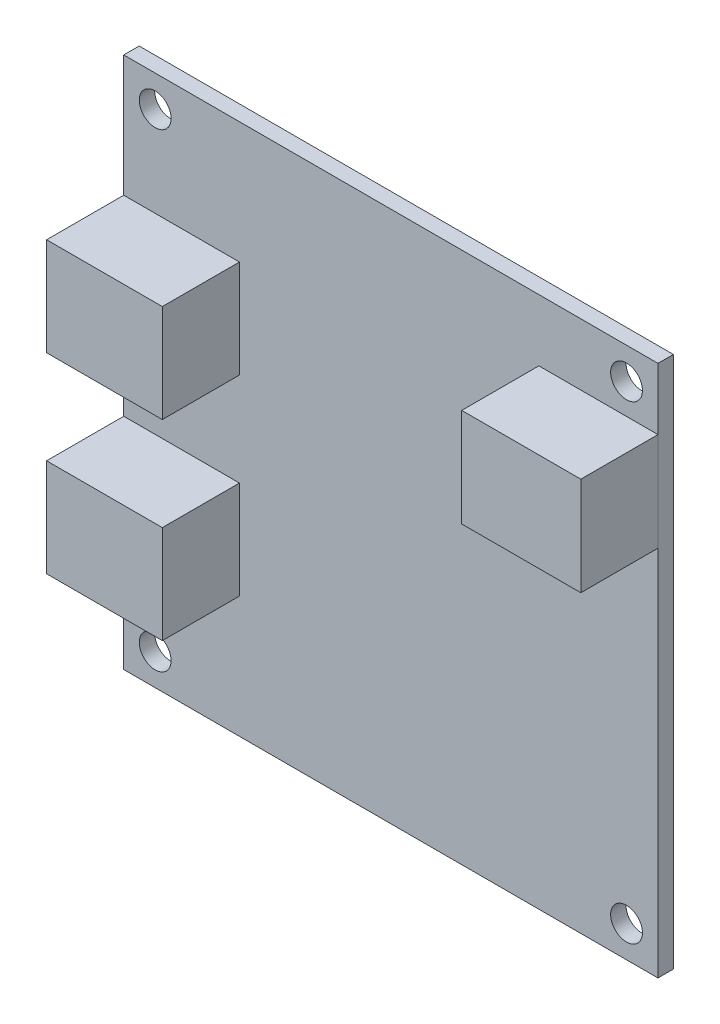
ISO-10303-21;
HEADER;
FILE_DESCRIPTION(('STEP AP214'),'2;1');
FILE_NAME('part.step','',(''),(''),'','','');
FILE_SCHEMA(('AUTOMOTIVE_DESIGN { 1 0 10303 214 1 1 1 1 }'));
ENDSEC;
DATA;
#1=APPLICATION_CONTEXT('core data for automotive mechanical design processes');
#2=APPLICATION_PROTOCOL_DEFINITION('international standard','automotive_design',2000,#1);
#3=PRODUCT_CONTEXT('',#1,'mechanical');
#4=PRODUCT('Part','Part','',(#3));
#5=PRODUCT_RELATED_PRODUCT_CATEGORY('part','',(#4));
#6=PRODUCT_DEFINITION_FORMATION('','',#4);
#7=PRODUCT_DEFINITION_CONTEXT('part definition',#1,'design');
#8=PRODUCT_DEFINITION('design','',#6,#7);
#9=PRODUCT_DEFINITION_SHAPE('','',#8);
#10=(LENGTH_UNIT() NAMED_UNIT(*) SI_UNIT(.MILLI.,.METRE.));
#11=(NAMED_UNIT(*) PLANE_ANGLE_UNIT() SI_UNIT($,.RADIAN.));
#12=(NAMED_UNIT(*) SI_UNIT($,.STERADIAN.) SOLID_ANGLE_UNIT());
#13=UNCERTAINTY_MEASURE_WITH_UNIT(LENGTH_MEASURE(1.E-05),#10,'distance_accuracy_value','');
#14=(GEOMETRIC_REPRESENTATION_CONTEXT(3) GLOBAL_UNCERTAINTY_ASSIGNED_CONTEXT((#13)) GLOBAL_UNIT_ASSIGNED_CONTEXT((#10,
#11,#12)) REPRESENTATION_CONTEXT('',''));
#15=CARTESIAN_POINT('',(0.,0.,0.));
#16=DIRECTION('',(0.,0.,1.));
#17=DIRECTION('',(1.,0.,0.));
#18=AXIS2_PLACEMENT_3D('',#15,#16,#17);
#19=CARTESIAN_POINT('',(15.35,0.,8.));
#20=DIRECTION('',(1.,0.,0.));
#21=DIRECTION('',(0.,0.,-1.));
#22=AXIS2_PLACEMENT_3D('',#19,#20,#21);
#23=PLANE('',#22);
#24=DIRECTION('',(0.,-1.,0.));
#25=VECTOR('',#24,1.);
#26=CARTESIAN_POINT('',(15.35,0.,0.));
#27=LINE('',#26,#25);
#28=CARTESIAN_POINT('',(15.35,21.2,0.));
#29=VERTEX_POINT('',#28);
#30=CARTESIAN_POINT('',(15.35,11.,0.));
#31=VERTEX_POINT('',#30);
#32=EDGE_CURVE('E117',#29,#31,#27,.T.);
#33=ORIENTED_EDGE('',*,*,#32,.T.);
#34=DIRECTION('',(0.,0.,-1.));
#35=VECTOR('',#34,1.);
#36=CARTESIAN_POINT('',(15.35,11.,8.));
#37=LINE('',#36,#35);
#38=CARTESIAN_POINT('',(15.35,11.,8.));
#39=VERTEX_POINT('',#38);
#40=EDGE_CURVE('E12',#39,#31,#37,.T.);
#41=ORIENTED_EDGE('',*,*,#40,.F.);
#42=DIRECTION('',(0.,-1.,0.));
#43=VECTOR('',#42,1.);
#44=CARTESIAN_POINT('',(15.35,0.,8.));
#45=LINE('',#44,#43);
#46=CARTESIAN_POINT('',(15.35,21.2,8.));
#47=VERTEX_POINT('',#46);
#48=EDGE_CURVE('E105',#47,#39,#45,.T.);
#49=ORIENTED_EDGE('',*,*,#48,.F.);
#50=DIRECTION('',(0.,0.,-1.));
#51=VECTOR('',#50,1.);
#52=CARTESIAN_POINT('',(15.35,21.2,8.));
#53=LINE('',#52,#51);
#54=EDGE_CURVE('E113',#47,#29,#53,.T.);
#55=ORIENTED_EDGE('',*,*,#54,.T.);
#56=EDGE_LOOP('',(#33,#41,#49,#55));
#57=FACE_BOUND('',#56,.T.);
#58=ADVANCED_FACE('F54',(#57),#23,.F.);
#59=CARTESIAN_POINT('',(0.,11.,8.));
#60=DIRECTION('',(0.,1.,0.));
#61=DIRECTION('',(0.,0.,1.));
#62=AXIS2_PLACEMENT_3D('',#59,#60,#61);
#63=PLANE('',#62);
#64=DIRECTION('',(1.,0.,0.));
#65=VECTOR('',#64,1.);
#66=CARTESIAN_POINT('',(0.,11.,0.));
#67=LINE('',#66,#65);
#68=CARTESIAN_POINT('',(27.7,11.,0.));
#69=VERTEX_POINT('',#68);
#70=EDGE_CURVE('E109',#31,#69,#67,.T.);
#71=ORIENTED_EDGE('',*,*,#70,.T.);
#72=DIRECTION('',(0.,0.,-1.));
#73=VECTOR('',#72,1.);
#74=CARTESIAN_POINT('',(27.7,11.,8.));
#75=LINE('',#74,#73);
#76=CARTESIAN_POINT('',(27.7,11.,8.));
#77=VERTEX_POINT('',#76);
#78=EDGE_CURVE('E62',#77,#69,#75,.T.);
#79=ORIENTED_EDGE('',*,*,#78,.F.);
#80=DIRECTION('',(1.,0.,0.));
#81=VECTOR('',#80,1.);
#82=CARTESIAN_POINT('',(0.,11.,8.));
#83=LINE('',#82,#81);
#84=EDGE_CURVE('E100',#39,#77,#83,.T.);
#85=ORIENTED_EDGE('',*,*,#84,.F.);
#86=ORIENTED_EDGE('',*,*,#40,.T.);
#87=EDGE_LOOP('',(#71,#79,#85,#86));
#88=FACE_BOUND('',#87,.T.);
#89=ADVANCED_FACE('F108',(#88),#63,.F.);
#90=CARTESIAN_POINT('',(27.7,0.,8.));
#91=DIRECTION('',(-1.,0.,0.));
#92=DIRECTION('',(0.,0.,1.));
#93=AXIS2_PLACEMENT_3D('',#90,#91,#92);
#94=PLANE('',#93);
#95=DIRECTION('',(0.,1.,0.));
#96=VECTOR('',#95,1.);
#97=CARTESIAN_POINT('',(27.7,0.,0.));
#98=LINE('',#97,#96);
#99=CARTESIAN_POINT('',(27.7,21.2,0.));
#100=VERTEX_POINT('',#99);
#101=EDGE_CURVE('E87',#69,#100,#98,.T.);
#102=ORIENTED_EDGE('',*,*,#101,.T.);
#103=DIRECTION('',(0.,0.,-1.));
#104=VECTOR('',#103,1.);
#105=CARTESIAN_POINT('',(27.7,21.2,8.));
#106=LINE('',#105,#104);
#107=CARTESIAN_POINT('',(27.7,21.2,8.));
#108=VERTEX_POINT('',#107);
#109=EDGE_CURVE('E110',#108,#100,#106,.T.);
#110=ORIENTED_EDGE('',*,*,#109,.F.);
#111=DIRECTION('',(0.,1.,0.));
#112=VECTOR('',#111,1.);
#113=CARTESIAN_POINT('',(27.7,0.,8.));
#114=LINE('',#113,#112);
#115=EDGE_CURVE('E103',#77,#108,#114,.T.);
#116=ORIENTED_EDGE('',*,*,#115,.F.);
#117=ORIENTED_EDGE('',*,*,#78,.T.);
#118=EDGE_LOOP('',(#102,#110,#116,#117));
#119=FACE_BOUND('',#118,.T.);
#120=ADVANCED_FACE('F111',(#119),#94,.F.);
#121=CARTESIAN_POINT('',(0.,21.2,8.));
#122=DIRECTION('',(0.,-1.,0.));
#123=DIRECTION('',(0.,0.,-1.));
#124=AXIS2_PLACEMENT_3D('',#121,#122,#123);
#125=PLANE('',#124);
#126=DIRECTION('',(-1.,0.,0.));
#127=VECTOR('',#126,1.);
#128=CARTESIAN_POINT('',(0.,21.2,0.));
#129=LINE('',#128,#127);
#130=EDGE_CURVE('E93',#100,#29,#129,.T.);
#131=ORIENTED_EDGE('',*,*,#130,.T.);
#132=ORIENTED_EDGE('',*,*,#54,.F.);
#133=DIRECTION('',(-1.,0.,0.));
#134=VECTOR('',#133,1.);
#135=CARTESIAN_POINT('',(0.,21.2,8.));
#136=LINE('',#135,#134);
#137=EDGE_CURVE('E70',#108,#47,#136,.T.);
#138=ORIENTED_EDGE('',*,*,#137,.F.);
#139=ORIENTED_EDGE('',*,*,#109,.T.);
#140=EDGE_LOOP('',(#131,#132,#138,#139));
#141=FACE_BOUND('',#140,.T.);
#142=ADVANCED_FACE('F124',(#141),#125,.F.);
#143=CARTESIAN_POINT('',(0.,0.,8.));
#144=DIRECTION('',(0.,0.,1.));
#145=DIRECTION('',(1.,0.,0.));
#146=AXIS2_PLACEMENT_3D('',#143,#144,#145);
#147=PLANE('',#146);
#148=ORIENTED_EDGE('',*,*,#48,.T.);
#149=ORIENTED_EDGE('',*,*,#84,.T.);
#150=ORIENTED_EDGE('',*,*,#115,.T.);
#151=ORIENTED_EDGE('',*,*,#137,.T.);
#152=EDGE_LOOP('',(#148,#149,#150,#151));
#153=FACE_BOUND('',#152,.T.);
#154=ADVANCED_FACE('F101',(#153),#147,.T.);
#155=CARTESIAN_POINT('',(0.,0.,0.));
#156=DIRECTION('',(0.,0.,1.));
#157=DIRECTION('',(1.,0.,0.));
#158=AXIS2_PLACEMENT_3D('',#155,#156,#157);
#159=PLANE('',#158);
#160=ORIENTED_EDGE('',*,*,#32,.F.);
#161=ORIENTED_EDGE('',*,*,#130,.F.);
#162=ORIENTED_EDGE('',*,*,#101,.F.);
#163=ORIENTED_EDGE('',*,*,#70,.F.);
#164=EDGE_LOOP('',(#160,#161,#162,#163));
#165=FACE_BOUND('',#164,.T.);
#166=ADVANCED_FACE('F127',(#165),#159,.F.);
#167=CLOSED_SHELL('',(#58,#89,#120,#142,#154,#166));
#168=MANIFOLD_SOLID_BREP('B2',#167);
#169=CARTESIAN_POINT('',(0.,-15.,8.));
#170=DIRECTION('',(0.,-1.,0.));
#171=DIRECTION('',(1.,0.,0.));
#172=AXIS2_PLACEMENT_3D('',#169,#170,#171);
#173=PLANE('',#172);
#174=DIRECTION('',(-1.,0.,0.));
#175=VECTOR('',#174,1.);
#176=CARTESIAN_POINT('',(0.,-15.,0.));
#177=LINE('',#176,#175);
#178=CARTESIAN_POINT('',(-15.7,-15.,0.));
#179=VERTEX_POINT('',#178);
#180=CARTESIAN_POINT('',(-27.7,-15.,0.));
#181=VERTEX_POINT('',#180);
#182=EDGE_CURVE('E257',#179,#181,#177,.T.);
#183=ORIENTED_EDGE('',*,*,#182,.F.);
#184=DIRECTION('',(0.,0.,-1.));
#185=VECTOR('',#184,1.);
#186=CARTESIAN_POINT('',(-15.7,-15.,8.));
#187=LINE('',#186,#185);
#188=CARTESIAN_POINT('',(-15.7,-15.,8.));
#189=VERTEX_POINT('',#188);
#190=EDGE_CURVE('E52',#189,#179,#187,.T.);
#191=ORIENTED_EDGE('',*,*,#190,.F.);
#192=DIRECTION('',(-1.,0.,0.));
#193=VECTOR('',#192,1.);
#194=CARTESIAN_POINT('',(0.,-15.,8.));
#195=LINE('',#194,#193);
#196=CARTESIAN_POINT('',(-27.7,-15.,8.));
#197=VERTEX_POINT('',#196);
#198=EDGE_CURVE('E249',#189,#197,#195,.T.);
#199=ORIENTED_EDGE('',*,*,#198,.T.);
#200=DIRECTION('',(0.,0.,-1.));
#201=VECTOR('',#200,1.);
#202=CARTESIAN_POINT('',(-27.7,-15.,8.));
#203=LINE('',#202,#201);
#204=EDGE_CURVE('E210',#197,#181,#203,.T.);
#205=ORIENTED_EDGE('',*,*,#204,.T.);
#206=EDGE_LOOP('',(#183,#191,#199,#205));
#207=FACE_BOUND('',#206,.T.);
#208=ADVANCED_FACE('F194',(#207),#173,.T.);
#209=CARTESIAN_POINT('',(-15.7,0.,8.));
#210=DIRECTION('',(1.,0.,0.));
#211=DIRECTION('',(0.,0.,-1.));
#212=AXIS2_PLACEMENT_3D('',#209,#210,#211);
#213=PLANE('',#212);
#214=DIRECTION('',(0.,-1.,0.));
#215=VECTOR('',#214,1.);
#216=CARTESIAN_POINT('',(-15.7,0.,0.));
#217=LINE('',#216,#215);
#218=CARTESIAN_POINT('',(-15.7,-4.85000000000001,0.));
#219=VERTEX_POINT('',#218);
#220=EDGE_CURVE('E240',#219,#179,#217,.T.);
#221=ORIENTED_EDGE('',*,*,#220,.F.);
#222=DIRECTION('',(0.,0.,-1.));
#223=VECTOR('',#222,1.);
#224=CARTESIAN_POINT('',(-15.7,-4.85000000000001,8.));
#225=LINE('',#224,#223);
#226=CARTESIAN_POINT('',(-15.7,-4.85000000000001,8.));
#227=VERTEX_POINT('',#226);
#228=EDGE_CURVE('E202',#227,#219,#225,.T.);
#229=ORIENTED_EDGE('',*,*,#228,.F.);
#230=DIRECTION('',(0.,-1.,0.));
#231=VECTOR('',#230,1.);
#232=CARTESIAN_POINT('',(-15.7,0.,8.));
#233=LINE('',#232,#231);
#234=EDGE_CURVE('E238',#227,#189,#233,.T.);
#235=ORIENTED_EDGE('',*,*,#234,.T.);
#236=ORIENTED_EDGE('',*,*,#190,.T.);
#237=EDGE_LOOP('',(#221,#229,#235,#236));
#238=FACE_BOUND('',#237,.T.);
#239=ADVANCED_FACE('F237',(#238),#213,.T.);
#240=CARTESIAN_POINT('',(0.,-4.85000000000001,8.));
#241=DIRECTION('',(0.,1.,0.));
#242=DIRECTION('',(0.,0.,1.));
#243=AXIS2_PLACEMENT_3D('',#240,#241,#242);
#244=PLANE('',#243);
#245=DIRECTION('',(1.,0.,0.));
#246=VECTOR('',#245,1.);
#247=CARTESIAN_POINT('',(0.,-4.85000000000001,0.));
#248=LINE('',#247,#246);
#249=CARTESIAN_POINT('',(-27.7,-4.85000000000001,0.));
#250=VERTEX_POINT('',#249);
#251=EDGE_CURVE('E260',#250,#219,#248,.T.);
#252=ORIENTED_EDGE('',*,*,#251,.F.);
#253=DIRECTION('',(0.,0.,-1.));
#254=VECTOR('',#253,1.);
#255=CARTESIAN_POINT('',(-27.7,-4.85000000000001,8.));
#256=LINE('',#255,#254);
#257=CARTESIAN_POINT('',(-27.7,-4.85000000000001,8.));
#258=VERTEX_POINT('',#257);
#259=EDGE_CURVE('E223',#258,#250,#256,.T.);
#260=ORIENTED_EDGE('',*,*,#259,.F.);
#261=DIRECTION('',(1.,0.,0.));
#262=VECTOR('',#261,1.);
#263=CARTESIAN_POINT('',(0.,-4.85000000000001,8.));
#264=LINE('',#263,#262);
#265=EDGE_CURVE('E248',#258,#227,#264,.T.);
#266=ORIENTED_EDGE('',*,*,#265,.T.);
#267=ORIENTED_EDGE('',*,*,#228,.T.);
#268=EDGE_LOOP('',(#252,#260,#266,#267));
#269=FACE_BOUND('',#268,.T.);
#270=ADVANCED_FACE('F251',(#269),#244,.T.);
#271=CARTESIAN_POINT('',(-27.7,0.,8.));
#272=DIRECTION('',(-1.,0.,0.));
#273=DIRECTION('',(0.,0.,1.));
#274=AXIS2_PLACEMENT_3D('',#271,#272,#273);
#275=PLANE('',#274);
#276=DIRECTION('',(0.,1.,0.));
#277=VECTOR('',#276,1.);
#278=CARTESIAN_POINT('',(-27.7,0.,0.));
#279=LINE('',#278,#277);
#280=EDGE_CURVE('E262',#181,#250,#279,.T.);
#281=ORIENTED_EDGE('',*,*,#280,.F.);
#282=ORIENTED_EDGE('',*,*,#204,.F.);
#283=DIRECTION('',(0.,1.,0.));
#284=VECTOR('',#283,1.);
#285=CARTESIAN_POINT('',(-27.7,0.,8.));
#286=LINE('',#285,#284);
#287=EDGE_CURVE('E252',#197,#258,#286,.T.);
#288=ORIENTED_EDGE('',*,*,#287,.T.);
#289=ORIENTED_EDGE('',*,*,#259,.T.);
#290=EDGE_LOOP('',(#281,#282,#288,#289));
#291=FACE_BOUND('',#290,.T.);
#292=ADVANCED_FACE('F267',(#291),#275,.T.);
#293=CARTESIAN_POINT('',(0.,0.,8.));
#294=DIRECTION('',(0.,0.,1.));
#295=DIRECTION('',(1.,0.,0.));
#296=AXIS2_PLACEMENT_3D('',#293,#294,#295);
#297=PLANE('',#296);
#298=ORIENTED_EDGE('',*,*,#198,.F.);
#299=ORIENTED_EDGE('',*,*,#234,.F.);
#300=ORIENTED_EDGE('',*,*,#265,.F.);
#301=ORIENTED_EDGE('',*,*,#287,.F.);
#302=EDGE_LOOP('',(#298,#299,#300,#301));
#303=FACE_BOUND('',#302,.T.);
#304=ADVANCED_FACE('F246',(#303),#297,.T.);
#305=CARTESIAN_POINT('',(0.,0.,0.));
#306=DIRECTION('',(0.,0.,1.));
#307=DIRECTION('',(1.,0.,0.));
#308=AXIS2_PLACEMENT_3D('',#305,#306,#307);
#309=PLANE('',#308);
#310=ORIENTED_EDGE('',*,*,#182,.T.);
#311=ORIENTED_EDGE('',*,*,#280,.T.);
#312=ORIENTED_EDGE('',*,*,#251,.T.);
#313=ORIENTED_EDGE('',*,*,#220,.T.);
#314=EDGE_LOOP('',(#310,#311,#312,#313));
#315=FACE_BOUND('',#314,.T.);
#316=ADVANCED_FACE('F274',(#315),#309,.F.);
#317=CLOSED_SHELL('',(#208,#239,#270,#292,#304,#316));
#318=MANIFOLD_SOLID_BREP('B6',#317);
#319=CARTESIAN_POINT('',(-27.7,0.,8.));
#320=DIRECTION('',(-1.,0.,0.));
#321=DIRECTION('',(0.,0.,1.));
#322=AXIS2_PLACEMENT_3D('',#319,#320,#321);
#323=PLANE('',#322);
#324=DIRECTION('',(0.,1.,0.));
#325=VECTOR('',#324,1.);
#326=CARTESIAN_POINT('',(-27.7,0.,0.));
#327=LINE('',#326,#325);
#328=CARTESIAN_POINT('',(-27.7,4.84999999999999,0.));
#329=VERTEX_POINT('',#328);
#330=CARTESIAN_POINT('',(-27.7,15.,0.));
#331=VERTEX_POINT('',#330);
#332=EDGE_CURVE('E399',#329,#331,#327,.T.);
#333=ORIENTED_EDGE('',*,*,#332,.F.);
#334=DIRECTION('',(0.,0.,-1.));
#335=VECTOR('',#334,1.);
#336=CARTESIAN_POINT('',(-27.7,4.84999999999999,8.));
#337=LINE('',#336,#335);
#338=CARTESIAN_POINT('',(-27.7,4.84999999999999,8.));
#339=VERTEX_POINT('',#338);
#340=EDGE_CURVE('E192',#339,#329,#337,.T.);
#341=ORIENTED_EDGE('',*,*,#340,.F.);
#342=DIRECTION('',(0.,1.,0.));
#343=VECTOR('',#342,1.);
#344=CARTESIAN_POINT('',(-27.7,0.,8.));
#345=LINE('',#344,#343);
#346=CARTESIAN_POINT('',(-27.7,15.,8.));
#347=VERTEX_POINT('',#346);
#348=EDGE_CURVE('E387',#339,#347,#345,.T.);
#349=ORIENTED_EDGE('',*,*,#348,.T.);
#350=DIRECTION('',(0.,0.,-1.));
#351=VECTOR('',#350,1.);
#352=CARTESIAN_POINT('',(-27.7,15.,8.));
#353=LINE('',#352,#351);
#354=EDGE_CURVE('E376',#347,#331,#353,.T.);
#355=ORIENTED_EDGE('',*,*,#354,.T.);
#356=EDGE_LOOP('',(#333,#341,#349,#355));
#357=FACE_BOUND('',#356,.T.);
#358=ADVANCED_FACE('F337',(#357),#323,.T.);
#359=CARTESIAN_POINT('',(0.,4.84999999999999,8.));
#360=DIRECTION('',(0.,1.,0.));
#361=DIRECTION('',(0.,0.,1.));
#362=AXIS2_PLACEMENT_3D('',#359,#360,#361);
#363=PLANE('',#362);
#364=DIRECTION('',(1.,0.,0.));
#365=VECTOR('',#364,1.);
#366=CARTESIAN_POINT('',(0.,4.84999999999999,0.));
#367=LINE('',#366,#365);
#368=CARTESIAN_POINT('',(-15.7,4.84999999999999,0.));
#369=VERTEX_POINT('',#368);
#370=EDGE_CURVE('E392',#329,#369,#367,.T.);
#371=ORIENTED_EDGE('',*,*,#370,.T.);
#372=DIRECTION('',(0.,0.,-1.));
#373=VECTOR('',#372,1.);
#374=CARTESIAN_POINT('',(-15.7,4.84999999999999,8.));
#375=LINE('',#374,#373);
#376=CARTESIAN_POINT('',(-15.7,4.84999999999999,8.));
#377=VERTEX_POINT('',#376);
#378=EDGE_CURVE('E345',#377,#369,#375,.T.);
#379=ORIENTED_EDGE('',*,*,#378,.F.);
#380=DIRECTION('',(1.,0.,0.));
#381=VECTOR('',#380,1.);
#382=CARTESIAN_POINT('',(0.,4.84999999999999,8.));
#383=LINE('',#382,#381);
#384=EDGE_CURVE('E382',#339,#377,#383,.T.);
#385=ORIENTED_EDGE('',*,*,#384,.F.);
#386=ORIENTED_EDGE('',*,*,#340,.T.);
#387=EDGE_LOOP('',(#371,#379,#385,#386));
#388=FACE_BOUND('',#387,.T.);
#389=ADVANCED_FACE('F390',(#388),#363,.F.);
#390=CARTESIAN_POINT('',(-15.7,0.,8.));
#391=DIRECTION('',(-1.,0.,0.));
#392=DIRECTION('',(0.,0.,1.));
#393=AXIS2_PLACEMENT_3D('',#390,#391,#392);
#394=PLANE('',#393);
#395=DIRECTION('',(0.,1.,0.));
#396=VECTOR('',#395,1.);
#397=CARTESIAN_POINT('',(-15.7,0.,0.));
#398=LINE('',#397,#396);
#399=CARTESIAN_POINT('',(-15.7,15.,0.));
#400=VERTEX_POINT('',#399);
#401=EDGE_CURVE('E369',#369,#400,#398,.T.);
#402=ORIENTED_EDGE('',*,*,#401,.T.);
#403=DIRECTION('',(0.,0.,-1.));
#404=VECTOR('',#403,1.);
#405=CARTESIAN_POINT('',(-15.7,15.,8.));
#406=LINE('',#405,#404);
#407=CARTESIAN_POINT('',(-15.7,15.,8.));
#408=VERTEX_POINT('',#407);
#409=EDGE_CURVE('E393',#408,#400,#406,.T.);
#410=ORIENTED_EDGE('',*,*,#409,.F.);
#411=DIRECTION('',(0.,1.,0.));
#412=VECTOR('',#411,1.);
#413=CARTESIAN_POINT('',(-15.7,0.,8.));
#414=LINE('',#413,#412);
#415=EDGE_CURVE('E386',#377,#408,#414,.T.);
#416=ORIENTED_EDGE('',*,*,#415,.F.);
#417=ORIENTED_EDGE('',*,*,#378,.T.);
#418=EDGE_LOOP('',(#402,#410,#416,#417));
#419=FACE_BOUND('',#418,.T.);
#420=ADVANCED_FACE('F394',(#419),#394,.F.);
#421=CARTESIAN_POINT('',(0.,15.,8.));
#422=DIRECTION('',(0.,-1.,0.));
#423=DIRECTION('',(1.,0.,0.));
#424=AXIS2_PLACEMENT_3D('',#421,#422,#423);
#425=PLANE('',#424);
#426=DIRECTION('',(-1.,0.,0.));
#427=VECTOR('',#426,1.);
#428=CARTESIAN_POINT('',(0.,15.,0.));
#429=LINE('',#428,#427);
#430=EDGE_CURVE('E404',#400,#331,#429,.T.);
#431=ORIENTED_EDGE('',*,*,#430,.T.);
#432=ORIENTED_EDGE('',*,*,#354,.F.);
#433=DIRECTION('',(-1.,0.,0.));
#434=VECTOR('',#433,1.);
#435=CARTESIAN_POINT('',(0.,15.,8.));
#436=LINE('',#435,#434);
#437=EDGE_CURVE('E353',#408,#347,#436,.T.);
#438=ORIENTED_EDGE('',*,*,#437,.F.);
#439=ORIENTED_EDGE('',*,*,#409,.T.);
#440=EDGE_LOOP('',(#431,#432,#438,#439));
#441=FACE_BOUND('',#440,.T.);
#442=ADVANCED_FACE('F409',(#441),#425,.F.);
#443=CARTESIAN_POINT('',(0.,0.,8.));
#444=DIRECTION('',(0.,0.,1.));
#445=DIRECTION('',(1.,0.,0.));
#446=AXIS2_PLACEMENT_3D('',#443,#444,#445);
#447=PLANE('',#446);
#448=ORIENTED_EDGE('',*,*,#348,.F.);
#449=ORIENTED_EDGE('',*,*,#384,.T.);
#450=ORIENTED_EDGE('',*,*,#415,.T.);
#451=ORIENTED_EDGE('',*,*,#437,.T.);
#452=EDGE_LOOP('',(#448,#449,#450,#451));
#453=FACE_BOUND('',#452,.T.);
#454=ADVANCED_FACE('F384',(#453),#447,.T.);
#455=CARTESIAN_POINT('',(0.,0.,0.));
#456=DIRECTION('',(0.,0.,1.));
#457=DIRECTION('',(1.,0.,0.));
#458=AXIS2_PLACEMENT_3D('',#455,#456,#457);
#459=PLANE('',#458);
#460=ORIENTED_EDGE('',*,*,#332,.T.);
#461=ORIENTED_EDGE('',*,*,#430,.F.);
#462=ORIENTED_EDGE('',*,*,#401,.F.);
#463=ORIENTED_EDGE('',*,*,#370,.F.);
#464=EDGE_LOOP('',(#460,#461,#462,#463));
#465=FACE_BOUND('',#464,.T.);
#466=ADVANCED_FACE('F411',(#465),#459,.F.);
#467=CLOSED_SHELL('',(#358,#389,#420,#442,#454,#466));
#468=MANIFOLD_SOLID_BREP('B46',#467);
#469=CARTESIAN_POINT('',(27.7,0.,-1.6));
#470=DIRECTION('',(1.,0.,0.));
#471=DIRECTION('',(0.,0.,-1.));
#472=AXIS2_PLACEMENT_3D('',#469,#470,#471);
#473=PLANE('',#472);
#474=DIRECTION('',(0.,1.,0.));
#475=VECTOR('',#474,1.);
#476=CARTESIAN_POINT('',(27.7,0.,0.));
#477=LINE('',#476,#475);
#478=CARTESIAN_POINT('',(27.7,-27.6,0.));
#479=VERTEX_POINT('',#478);
#480=CARTESIAN_POINT('',(27.7,27.6,0.));
#481=VERTEX_POINT('',#480);
#482=EDGE_CURVE('E558',#479,#481,#477,.T.);
#483=ORIENTED_EDGE('',*,*,#482,.F.);
#484=DIRECTION('',(0.,0.,1.));
#485=VECTOR('',#484,1.);
#486=CARTESIAN_POINT('',(27.7,-27.6,-1.6));
#487=LINE('',#486,#485);
#488=CARTESIAN_POINT('',(27.7,-27.6,-1.6));
#489=VERTEX_POINT('',#488);
#490=EDGE_CURVE('E335',#489,#479,#487,.T.);
#491=ORIENTED_EDGE('',*,*,#490,.F.);
#492=DIRECTION('',(0.,1.,0.));
#493=VECTOR('',#492,1.);
#494=CARTESIAN_POINT('',(27.7,0.,-1.6));
#495=LINE('',#494,#493);
#496=CARTESIAN_POINT('',(27.7,27.6,-1.6));
#497=VERTEX_POINT('',#496);
#498=EDGE_CURVE('E534',#489,#497,#495,.T.);
#499=ORIENTED_EDGE('',*,*,#498,.T.);
#500=DIRECTION('',(0.,0.,1.));
#501=VECTOR('',#500,1.);
#502=CARTESIAN_POINT('',(27.7,27.6,-1.6));
#503=LINE('',#502,#501);
#504=EDGE_CURVE('E474',#497,#481,#503,.T.);
#505=ORIENTED_EDGE('',*,*,#504,.T.);
#506=EDGE_LOOP('',(#483,#491,#499,#505));
#507=FACE_BOUND('',#506,.T.);
#508=ADVANCED_FACE('F471',(#507),#473,.T.);
#509=CARTESIAN_POINT('',(0.,-27.6,-1.6));
#510=DIRECTION('',(0.,-1.,0.));
#511=DIRECTION('',(0.,0.,-1.));
#512=AXIS2_PLACEMENT_3D('',#509,#510,#511);
#513=PLANE('',#512);
#514=DIRECTION('',(1.,0.,0.));
#515=VECTOR('',#514,1.);
#516=CARTESIAN_POINT('',(0.,-27.6,0.));
#517=LINE('',#516,#515);
#518=CARTESIAN_POINT('',(-27.7,-27.6,0.));
#519=VERTEX_POINT('',#518);
#520=EDGE_CURVE('E567',#519,#479,#517,.T.);
#521=ORIENTED_EDGE('',*,*,#520,.F.);
#522=DIRECTION('',(0.,0.,1.));
#523=VECTOR('',#522,1.);
#524=CARTESIAN_POINT('',(-27.7,-27.6,-1.6));
#525=LINE('',#524,#523);
#526=CARTESIAN_POINT('',(-27.7,-27.6,-1.6));
#527=VERTEX_POINT('',#526);
#528=EDGE_CURVE('E481',#527,#519,#525,.T.);
#529=ORIENTED_EDGE('',*,*,#528,.F.);
#530=DIRECTION('',(1.,0.,0.));
#531=VECTOR('',#530,1.);
#532=CARTESIAN_POINT('',(0.,-27.6,-1.6));
#533=LINE('',#532,#531);
#534=EDGE_CURVE('E521',#527,#489,#533,.T.);
#535=ORIENTED_EDGE('',*,*,#534,.T.);
#536=ORIENTED_EDGE('',*,*,#490,.T.);
#537=EDGE_LOOP('',(#521,#529,#535,#536));
#538=FACE_BOUND('',#537,.T.);
#539=ADVANCED_FACE('F591',(#538),#513,.T.);
#540=CARTESIAN_POINT('',(-27.7,0.,-1.6));
#541=DIRECTION('',(1.,0.,0.));
#542=DIRECTION('',(0.,0.,-1.));
#543=AXIS2_PLACEMENT_3D('',#540,#541,#542);
#544=PLANE('',#543);
#545=DIRECTION('',(0.,1.,0.));
#546=VECTOR('',#545,1.);
#547=CARTESIAN_POINT('',(-27.7,0.,0.));
#548=LINE('',#547,#546);
#549=CARTESIAN_POINT('',(-27.7,27.6,0.));
#550=VERTEX_POINT('',#549);
#551=EDGE_CURVE('E527',#519,#550,#548,.T.);
#552=ORIENTED_EDGE('',*,*,#551,.T.);
#553=DIRECTION('',(0.,0.,1.));
#554=VECTOR('',#553,1.);
#555=CARTESIAN_POINT('',(-27.7,27.6,-1.6));
#556=LINE('',#555,#554);
#557=CARTESIAN_POINT('',(-27.7,27.6,-1.6));
#558=VERTEX_POINT('',#557);
#559=EDGE_CURVE('E525',#558,#550,#556,.T.);
#560=ORIENTED_EDGE('',*,*,#559,.F.);
#561=DIRECTION('',(0.,1.,0.));
#562=VECTOR('',#561,1.);
#563=CARTESIAN_POINT('',(-27.7,0.,-1.6));
#564=LINE('',#563,#562);
#565=EDGE_CURVE('E517',#527,#558,#564,.T.);
#566=ORIENTED_EDGE('',*,*,#565,.F.);
#567=ORIENTED_EDGE('',*,*,#528,.T.);
#568=EDGE_LOOP('',(#552,#560,#566,#567));
#569=FACE_BOUND('',#568,.T.);
#570=ADVANCED_FACE('F526',(#569),#544,.F.);
#571=CARTESIAN_POINT('',(-24.4382246376811,-24.35,-1.6));
#572=DIRECTION('',(0.,0.,1.));
#573=DIRECTION('',(1.,0.,0.));
#574=AXIS2_PLACEMENT_3D('',#571,#572,#573);
#575=CYLINDRICAL_SURFACE('',#574,1.65);
#576=CARTESIAN_POINT('',(-24.4382246376811,-24.35,-1.6));
#577=DIRECTION('',(0.,0.,1.));
#578=DIRECTION('',(1.,0.,0.));
#579=AXIS2_PLACEMENT_3D('',#576,#577,#578);
#580=CIRCLE('',#579,1.65);
#581=CARTESIAN_POINT('',(-22.7882246376811,-24.35,-1.6));
#582=VERTEX_POINT('',#581);
#583=EDGE_CURVE('E550',#582,#582,#580,.T.);
#584=ORIENTED_EDGE('',*,*,#583,.F.);
#585=EDGE_LOOP('',(#584));
#586=FACE_BOUND('',#585,.T.);
#587=CARTESIAN_POINT('',(-24.4382246376811,-24.35,0.));
#588=DIRECTION('',(0.,0.,1.));
#589=DIRECTION('',(1.,0.,0.));
#590=AXIS2_PLACEMENT_3D('',#587,#588,#589);
#591=CIRCLE('',#590,1.65);
#592=CARTESIAN_POINT('',(-22.7882246376811,-24.35,0.));
#593=VERTEX_POINT('',#592);
#594=EDGE_CURVE('E579',#593,#593,#591,.T.);
#595=ORIENTED_EDGE('',*,*,#594,.T.);
#596=EDGE_LOOP('',(#595));
#597=FACE_BOUND('',#596,.T.);
#598=ADVANCED_FACE('F598',(#586,#597),#575,.F.);
#599=CARTESIAN_POINT('',(24.4382246376812,24.35,-1.6));
#600=DIRECTION('',(0.,0.,1.));
#601=DIRECTION('',(1.,0.,0.));
#602=AXIS2_PLACEMENT_3D('',#599,#600,#601);
#603=CYLINDRICAL_SURFACE('',#602,1.65);
#604=CARTESIAN_POINT('',(24.4382246376812,24.35,-1.6));
#605=DIRECTION('',(0.,0.,1.));
#606=DIRECTION('',(1.,0.,0.));
#607=AXIS2_PLACEMENT_3D('',#604,#605,#606);
#608=CIRCLE('',#607,1.65);
#609=CARTESIAN_POINT('',(26.0882246376812,24.35,-1.6));
#610=VERTEX_POINT('',#609);
#611=EDGE_CURVE('E546',#610,#610,#608,.T.);
#612=ORIENTED_EDGE('',*,*,#611,.F.);
#613=EDGE_LOOP('',(#612));
#614=FACE_BOUND('',#613,.T.);
#615=CARTESIAN_POINT('',(24.4382246376812,24.35,0.));
#616=DIRECTION('',(0.,0.,1.));
#617=DIRECTION('',(1.,0.,0.));
#618=AXIS2_PLACEMENT_3D('',#615,#616,#617);
#619=CIRCLE('',#618,1.65);
#620=CARTESIAN_POINT('',(26.0882246376812,24.35,0.));
#621=VERTEX_POINT('',#620);
#622=EDGE_CURVE('E575',#621,#621,#619,.T.);
#623=ORIENTED_EDGE('',*,*,#622,.T.);
#624=EDGE_LOOP('',(#623));
#625=FACE_BOUND('',#624,.T.);
#626=ADVANCED_FACE('F611',(#614,#625),#603,.F.);
#627=CARTESIAN_POINT('',(24.4382246376812,-24.35,-1.6));
#628=DIRECTION('',(0.,0.,1.));
#629=DIRECTION('',(1.,0.,0.));
#630=AXIS2_PLACEMENT_3D('',#627,#628,#629);
#631=CYLINDRICAL_SURFACE('',#630,1.65);
#632=CARTESIAN_POINT('',(24.4382246376812,-24.35,-1.6));
#633=DIRECTION('',(0.,0.,1.));
#634=DIRECTION('',(1.,0.,0.));
#635=AXIS2_PLACEMENT_3D('',#632,#633,#634);
#636=CIRCLE('',#635,1.65);
#637=CARTESIAN_POINT('',(26.0882246376812,-24.35,-1.6));
#638=VERTEX_POINT('',#637);
#639=EDGE_CURVE('E542',#638,#638,#636,.F.);
#640=ORIENTED_EDGE('',*,*,#639,.T.);
#641=EDGE_LOOP('',(#640));
#642=FACE_BOUND('',#641,.T.);
#643=CARTESIAN_POINT('',(24.4382246376812,-24.35,0.));
#644=DIRECTION('',(0.,0.,1.));
#645=DIRECTION('',(1.,0.,0.));
#646=AXIS2_PLACEMENT_3D('',#643,#644,#645);
#647=CIRCLE('',#646,1.65);
#648=CARTESIAN_POINT('',(26.0882246376812,-24.35,0.));
#649=VERTEX_POINT('',#648);
#650=EDGE_CURVE('E571',#649,#649,#647,.F.);
#651=ORIENTED_EDGE('',*,*,#650,.F.);
#652=EDGE_LOOP('',(#651));
#653=FACE_BOUND('',#652,.T.);
#654=ADVANCED_FACE('F601',(#642,#653),#631,.F.);
#655=CARTESIAN_POINT('',(0.,27.6,-1.6));
#656=DIRECTION('',(0.,-1.,0.));
#657=DIRECTION('',(0.,0.,-1.));
#658=AXIS2_PLACEMENT_3D('',#655,#656,#657);
#659=PLANE('',#658);
#660=DIRECTION('',(1.,0.,0.));
#661=VECTOR('',#660,1.);
#662=CARTESIAN_POINT('',(0.,27.6,0.));
#663=LINE('',#662,#661);
#664=EDGE_CURVE('E562',#550,#481,#663,.T.);
#665=ORIENTED_EDGE('',*,*,#664,.T.);
#666=ORIENTED_EDGE('',*,*,#504,.F.);
#667=DIRECTION('',(1.,0.,0.));
#668=VECTOR('',#667,1.);
#669=CARTESIAN_POINT('',(0.,27.6,-1.6));
#670=LINE('',#669,#668);
#671=EDGE_CURVE('E514',#558,#497,#670,.T.);
#672=ORIENTED_EDGE('',*,*,#671,.F.);
#673=ORIENTED_EDGE('',*,*,#559,.T.);
#674=EDGE_LOOP('',(#665,#666,#672,#673));
#675=FACE_BOUND('',#674,.T.);
#676=ADVANCED_FACE('F532',(#675),#659,.F.);
#677=CARTESIAN_POINT('',(-24.4382246376811,24.35,-1.6));
#678=DIRECTION('',(0.,0.,1.));
#679=DIRECTION('',(1.,0.,0.));
#680=AXIS2_PLACEMENT_3D('',#677,#678,#679);
#681=CYLINDRICAL_SURFACE('',#680,1.65);
#682=CARTESIAN_POINT('',(-24.4382246376811,24.35,-1.6));
#683=DIRECTION('',(0.,0.,1.));
#684=DIRECTION('',(1.,0.,0.));
#685=AXIS2_PLACEMENT_3D('',#682,#683,#684);
#686=CIRCLE('',#685,1.65);
#687=CARTESIAN_POINT('',(-22.7882246376811,24.35,-1.6));
#688=VERTEX_POINT('',#687);
#689=EDGE_CURVE('E554',#688,#688,#686,.F.);
#690=ORIENTED_EDGE('',*,*,#689,.T.);
#691=EDGE_LOOP('',(#690));
#692=FACE_BOUND('',#691,.T.);
#693=CARTESIAN_POINT('',(-24.4382246376811,24.35,0.));
#694=DIRECTION('',(0.,0.,1.));
#695=DIRECTION('',(1.,0.,0.));
#696=AXIS2_PLACEMENT_3D('',#693,#694,#695);
#697=CIRCLE('',#696,1.65);
#698=CARTESIAN_POINT('',(-22.7882246376811,24.35,0.));
#699=VERTEX_POINT('',#698);
#700=EDGE_CURVE('E537',#699,#699,#697,.F.);
#701=ORIENTED_EDGE('',*,*,#700,.F.);
#702=EDGE_LOOP('',(#701));
#703=FACE_BOUND('',#702,.T.);
#704=ADVANCED_FACE('F604',(#692,#703),#681,.F.);
#705=CARTESIAN_POINT('',(0.,0.,-1.6));
#706=DIRECTION('',(0.,0.,1.));
#707=DIRECTION('',(1.,0.,0.));
#708=AXIS2_PLACEMENT_3D('',#705,#706,#707);
#709=PLANE('',#708);
#710=ORIENTED_EDGE('',*,*,#498,.F.);
#711=ORIENTED_EDGE('',*,*,#534,.F.);
#712=ORIENTED_EDGE('',*,*,#565,.T.);
#713=ORIENTED_EDGE('',*,*,#671,.T.);
#714=EDGE_LOOP('',(#710,#711,#712,#713));
#715=FACE_BOUND('',#714,.T.);
#716=ORIENTED_EDGE('',*,*,#639,.F.);
#717=EDGE_LOOP('',(#716));
#718=FACE_BOUND('',#717,.T.);
#719=ORIENTED_EDGE('',*,*,#611,.T.);
#720=EDGE_LOOP('',(#719));
#721=FACE_BOUND('',#720,.T.);
#722=ORIENTED_EDGE('',*,*,#583,.T.);
#723=EDGE_LOOP('',(#722));
#724=FACE_BOUND('',#723,.T.);
#725=ORIENTED_EDGE('',*,*,#689,.F.);
#726=EDGE_LOOP('',(#725));
#727=FACE_BOUND('',#726,.T.);
#728=ADVANCED_FACE('F519',(#715,#718,#721,#724,#727),#709,.F.);
#729=CARTESIAN_POINT('',(0.,0.,0.));
#730=DIRECTION('',(0.,0.,1.));
#731=DIRECTION('',(1.,0.,0.));
#732=AXIS2_PLACEMENT_3D('',#729,#730,#731);
#733=PLANE('',#732);
#734=ORIENTED_EDGE('',*,*,#482,.T.);
#735=ORIENTED_EDGE('',*,*,#664,.F.);
#736=ORIENTED_EDGE('',*,*,#551,.F.);
#737=ORIENTED_EDGE('',*,*,#520,.T.);
#738=EDGE_LOOP('',(#734,#735,#736,#737));
#739=FACE_BOUND('',#738,.T.);
#740=ORIENTED_EDGE('',*,*,#650,.T.);
#741=EDGE_LOOP('',(#740));
#742=FACE_BOUND('',#741,.T.);
#743=ORIENTED_EDGE('',*,*,#622,.F.);
#744=EDGE_LOOP('',(#743));
#745=FACE_BOUND('',#744,.T.);
#746=ORIENTED_EDGE('',*,*,#594,.F.);
#747=EDGE_LOOP('',(#746));
#748=FACE_BOUND('',#747,.T.);
#749=ORIENTED_EDGE('',*,*,#700,.T.);
#750=EDGE_LOOP('',(#749));
#751=FACE_BOUND('',#750,.T.);
#752=ADVANCED_FACE('F589',(#739,#742,#745,#748,#751),#733,.T.);
#753=CLOSED_SHELL('',(#508,#539,#570,#598,#626,#654,#676,#704,#728,#752));
#754=MANIFOLD_SOLID_BREP('B186',#753);
#755=ADVANCED_BREP_SHAPE_REPRESENTATION('',(#18,#168,#318,#468,#754),#14);
#756=SHAPE_DEFINITION_REPRESENTATION(#9,#755);
ENDSEC;
END-ISO-10303-21;
